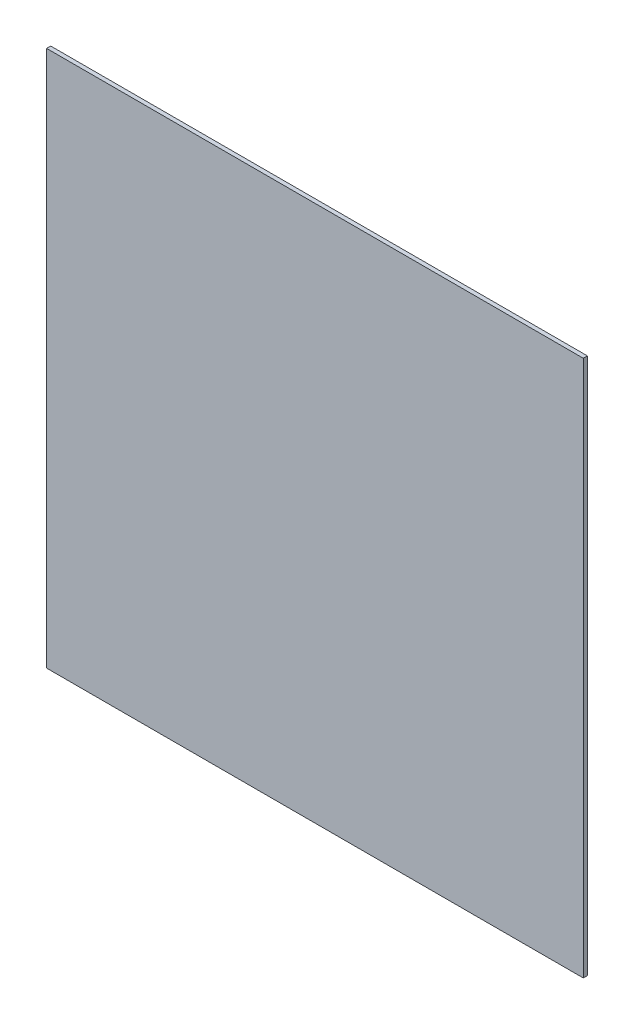
ISO-10303-21;
HEADER;
FILE_DESCRIPTION(('STEP AP214'),'2;1');
FILE_NAME('part.step','',(''),(''),'','','');
FILE_SCHEMA(('AUTOMOTIVE_DESIGN { 1 0 10303 214 1 1 1 1 }'));
ENDSEC;
DATA;
#1=APPLICATION_CONTEXT('core data for automotive mechanical design processes');
#2=APPLICATION_PROTOCOL_DEFINITION('international standard','automotive_design',2000,#1);
#3=PRODUCT_CONTEXT('',#1,'mechanical');
#4=PRODUCT('Part','Part','',(#3));
#5=PRODUCT_RELATED_PRODUCT_CATEGORY('part','',(#4));
#6=PRODUCT_DEFINITION_FORMATION('','',#4);
#7=PRODUCT_DEFINITION_CONTEXT('part definition',#1,'design');
#8=PRODUCT_DEFINITION('design','',#6,#7);
#9=PRODUCT_DEFINITION_SHAPE('','',#8);
#10=(LENGTH_UNIT() NAMED_UNIT(*) SI_UNIT(.MILLI.,.METRE.));
#11=(NAMED_UNIT(*) PLANE_ANGLE_UNIT() SI_UNIT($,.RADIAN.));
#12=(NAMED_UNIT(*) SI_UNIT($,.STERADIAN.) SOLID_ANGLE_UNIT());
#13=UNCERTAINTY_MEASURE_WITH_UNIT(LENGTH_MEASURE(1.E-05),#10,'distance_accuracy_value','');
#14=(GEOMETRIC_REPRESENTATION_CONTEXT(3) GLOBAL_UNCERTAINTY_ASSIGNED_CONTEXT((#13)) GLOBAL_UNIT_ASSIGNED_CONTEXT((#10,
#11,#12)) REPRESENTATION_CONTEXT('',''));
#15=CARTESIAN_POINT('',(0.,0.,0.));
#16=DIRECTION('',(0.,0.,1.));
#17=DIRECTION('',(1.,0.,0.));
#18=AXIS2_PLACEMENT_3D('',#15,#16,#17);
#19=CARTESIAN_POINT('',(195.5,195.5,3.));
#20=DIRECTION('',(-1.,0.,0.));
#21=DIRECTION('',(0.,-1.,0.));
#22=AXIS2_PLACEMENT_3D('',#19,#20,#21);
#23=PLANE('',#22);
#24=DIRECTION('',(0.,1.,0.));
#25=VECTOR('',#24,1.);
#26=CARTESIAN_POINT('',(195.5,195.5,0.));
#27=LINE('',#26,#25);
#28=CARTESIAN_POINT('',(195.5,-195.5,0.));
#29=VERTEX_POINT('',#28);
#30=CARTESIAN_POINT('',(195.5,195.5,0.));
#31=VERTEX_POINT('',#30);
#32=EDGE_CURVE('E107',#29,#31,#27,.T.);
#33=ORIENTED_EDGE('',*,*,#32,.T.);
#34=DIRECTION('',(0.,0.,-1.));
#35=VECTOR('',#34,1.);
#36=CARTESIAN_POINT('',(195.5,195.5,3.));
#37=LINE('',#36,#35);
#38=CARTESIAN_POINT('',(195.5,195.5,3.));
#39=VERTEX_POINT('',#38);
#40=EDGE_CURVE('E11',#39,#31,#37,.T.);
#41=ORIENTED_EDGE('',*,*,#40,.F.);
#42=DIRECTION('',(0.,1.,0.));
#43=VECTOR('',#42,1.);
#44=CARTESIAN_POINT('',(195.5,195.5,3.));
#45=LINE('',#44,#43);
#46=CARTESIAN_POINT('',(195.5,-195.5,3.));
#47=VERTEX_POINT('',#46);
#48=EDGE_CURVE('E91',#47,#39,#45,.T.);
#49=ORIENTED_EDGE('',*,*,#48,.F.);
#50=DIRECTION('',(0.,0.,-1.));
#51=VECTOR('',#50,1.);
#52=CARTESIAN_POINT('',(195.5,-195.5,3.));
#53=LINE('',#52,#51);
#54=EDGE_CURVE('E103',#47,#29,#53,.T.);
#55=ORIENTED_EDGE('',*,*,#54,.T.);
#56=EDGE_LOOP('',(#33,#41,#49,#55));
#57=FACE_BOUND('',#56,.T.);
#58=ADVANCED_FACE('F39',(#57),#23,.F.);
#59=CARTESIAN_POINT('',(-195.5,195.5,3.));
#60=DIRECTION('',(0.,-1.,0.));
#61=DIRECTION('',(0.,0.,-1.));
#62=AXIS2_PLACEMENT_3D('',#59,#60,#61);
#63=PLANE('',#62);
#64=DIRECTION('',(-1.,0.,0.));
#65=VECTOR('',#64,1.);
#66=CARTESIAN_POINT('',(-195.5,195.5,0.));
#67=LINE('',#66,#65);
#68=CARTESIAN_POINT('',(-195.5,195.5,0.));
#69=VERTEX_POINT('',#68);
#70=EDGE_CURVE('E96',#31,#69,#67,.T.);
#71=ORIENTED_EDGE('',*,*,#70,.T.);
#72=DIRECTION('',(0.,0.,-1.));
#73=VECTOR('',#72,1.);
#74=CARTESIAN_POINT('',(-195.5,195.5,3.));
#75=LINE('',#74,#73);
#76=CARTESIAN_POINT('',(-195.5,195.5,3.));
#77=VERTEX_POINT('',#76);
#78=EDGE_CURVE('E48',#77,#69,#75,.T.);
#79=ORIENTED_EDGE('',*,*,#78,.F.);
#80=DIRECTION('',(-1.,0.,0.));
#81=VECTOR('',#80,1.);
#82=CARTESIAN_POINT('',(-195.5,195.5,3.));
#83=LINE('',#82,#81);
#84=EDGE_CURVE('E86',#39,#77,#83,.T.);
#85=ORIENTED_EDGE('',*,*,#84,.F.);
#86=ORIENTED_EDGE('',*,*,#40,.T.);
#87=EDGE_LOOP('',(#71,#79,#85,#86));
#88=FACE_BOUND('',#87,.T.);
#89=ADVANCED_FACE('F95',(#88),#63,.F.);
#90=CARTESIAN_POINT('',(-195.5,195.5,3.));
#91=DIRECTION('',(1.,0.,0.));
#92=DIRECTION('',(0.,1.,0.));
#93=AXIS2_PLACEMENT_3D('',#90,#91,#92);
#94=PLANE('',#93);
#95=DIRECTION('',(0.,-1.,0.));
#96=VECTOR('',#95,1.);
#97=CARTESIAN_POINT('',(-195.5,195.5,0.));
#98=LINE('',#97,#96);
#99=CARTESIAN_POINT('',(-195.5,-195.5,0.));
#100=VERTEX_POINT('',#99);
#101=EDGE_CURVE('E73',#69,#100,#98,.T.);
#102=ORIENTED_EDGE('',*,*,#101,.T.);
#103=DIRECTION('',(0.,0.,-1.));
#104=VECTOR('',#103,1.);
#105=CARTESIAN_POINT('',(-195.5,-195.5,3.));
#106=LINE('',#105,#104);
#107=CARTESIAN_POINT('',(-195.5,-195.5,3.));
#108=VERTEX_POINT('',#107);
#109=EDGE_CURVE('E98',#108,#100,#106,.T.);
#110=ORIENTED_EDGE('',*,*,#109,.F.);
#111=DIRECTION('',(0.,-1.,0.));
#112=VECTOR('',#111,1.);
#113=CARTESIAN_POINT('',(-195.5,195.5,3.));
#114=LINE('',#113,#112);
#115=EDGE_CURVE('E89',#77,#108,#114,.T.);
#116=ORIENTED_EDGE('',*,*,#115,.F.);
#117=ORIENTED_EDGE('',*,*,#78,.T.);
#118=EDGE_LOOP('',(#102,#110,#116,#117));
#119=FACE_BOUND('',#118,.T.);
#120=ADVANCED_FACE('F99',(#119),#94,.F.);
#121=CARTESIAN_POINT('',(-195.5,-195.5,3.));
#122=DIRECTION('',(0.,1.,0.));
#123=DIRECTION('',(0.,0.,1.));
#124=AXIS2_PLACEMENT_3D('',#121,#122,#123);
#125=PLANE('',#124);
#126=DIRECTION('',(1.,0.,0.));
#127=VECTOR('',#126,1.);
#128=CARTESIAN_POINT('',(-195.5,-195.5,0.));
#129=LINE('',#128,#127);
#130=EDGE_CURVE('E79',#100,#29,#129,.T.);
#131=ORIENTED_EDGE('',*,*,#130,.T.);
#132=ORIENTED_EDGE('',*,*,#54,.F.);
#133=DIRECTION('',(1.,0.,0.));
#134=VECTOR('',#133,1.);
#135=CARTESIAN_POINT('',(-195.5,-195.5,3.));
#136=LINE('',#135,#134);
#137=EDGE_CURVE('E56',#108,#47,#136,.T.);
#138=ORIENTED_EDGE('',*,*,#137,.F.);
#139=ORIENTED_EDGE('',*,*,#109,.T.);
#140=EDGE_LOOP('',(#131,#132,#138,#139));
#141=FACE_BOUND('',#140,.T.);
#142=ADVANCED_FACE('F120',(#141),#125,.F.);
#143=CARTESIAN_POINT('',(0.,0.,3.));
#144=DIRECTION('',(0.,0.,1.));
#145=DIRECTION('',(1.,0.,0.));
#146=AXIS2_PLACEMENT_3D('',#143,#144,#145);
#147=PLANE('',#146);
#148=ORIENTED_EDGE('',*,*,#48,.T.);
#149=ORIENTED_EDGE('',*,*,#84,.T.);
#150=ORIENTED_EDGE('',*,*,#115,.T.);
#151=ORIENTED_EDGE('',*,*,#137,.T.);
#152=EDGE_LOOP('',(#148,#149,#150,#151));
#153=FACE_BOUND('',#152,.T.);
#154=ADVANCED_FACE('F87',(#153),#147,.T.);
#155=CARTESIAN_POINT('',(0.,0.,0.));
#156=DIRECTION('',(0.,0.,1.));
#157=DIRECTION('',(1.,0.,0.));
#158=AXIS2_PLACEMENT_3D('',#155,#156,#157);
#159=PLANE('',#158);
#160=ORIENTED_EDGE('',*,*,#32,.F.);
#161=ORIENTED_EDGE('',*,*,#130,.F.);
#162=ORIENTED_EDGE('',*,*,#101,.F.);
#163=ORIENTED_EDGE('',*,*,#70,.F.);
#164=EDGE_LOOP('',(#160,#161,#162,#163));
#165=FACE_BOUND('',#164,.T.);
#166=ADVANCED_FACE('F123',(#165),#159,.F.);
#167=CLOSED_SHELL('',(#58,#89,#120,#142,#154,#166));
#168=MANIFOLD_SOLID_BREP('B2',#167);
#169=ADVANCED_BREP_SHAPE_REPRESENTATION('',(#18,#168),#14);
#170=SHAPE_DEFINITION_REPRESENTATION(#9,#169);
ENDSEC;
END-ISO-10303-21;
